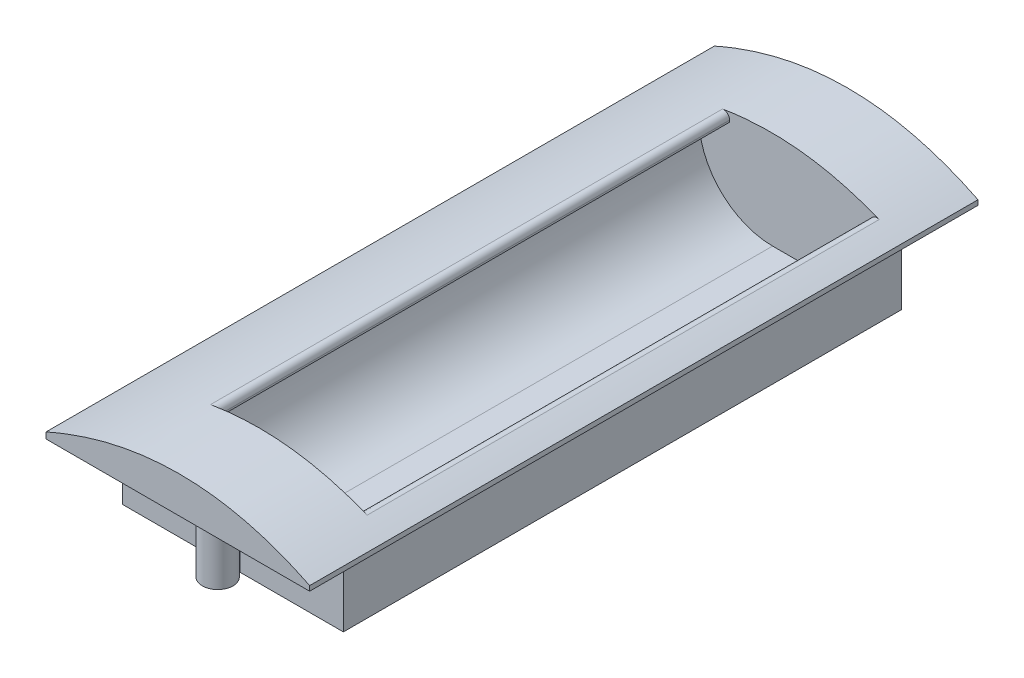
ISO-10303-21;
HEADER;
FILE_DESCRIPTION(('STEP AP214'),'2;1');
FILE_NAME('part.step','',(''),(''),'','','');
FILE_SCHEMA(('AUTOMOTIVE_DESIGN { 1 0 10303 214 1 1 1 1 }'));
ENDSEC;
DATA;
#1=APPLICATION_CONTEXT('core data for automotive mechanical design processes');
#2=APPLICATION_PROTOCOL_DEFINITION('international standard','automotive_design',2000,#1);
#3=PRODUCT_CONTEXT('',#1,'mechanical');
#4=PRODUCT('Part','Part','',(#3));
#5=PRODUCT_RELATED_PRODUCT_CATEGORY('part','',(#4));
#6=PRODUCT_DEFINITION_FORMATION('','',#4);
#7=PRODUCT_DEFINITION_CONTEXT('part definition',#1,'design');
#8=PRODUCT_DEFINITION('design','',#6,#7);
#9=PRODUCT_DEFINITION_SHAPE('','',#8);
#10=(LENGTH_UNIT() NAMED_UNIT(*) SI_UNIT(.MILLI.,.METRE.));
#11=(NAMED_UNIT(*) PLANE_ANGLE_UNIT() SI_UNIT($,.RADIAN.));
#12=(NAMED_UNIT(*) SI_UNIT($,.STERADIAN.) SOLID_ANGLE_UNIT());
#13=UNCERTAINTY_MEASURE_WITH_UNIT(LENGTH_MEASURE(1.E-05),#10,'distance_accuracy_value','');
#14=(GEOMETRIC_REPRESENTATION_CONTEXT(3) GLOBAL_UNCERTAINTY_ASSIGNED_CONTEXT((#13)) GLOBAL_UNIT_ASSIGNED_CONTEXT((#10,
#11,#12)) REPRESENTATION_CONTEXT('',''));
#15=CARTESIAN_POINT('',(0.,0.,0.));
#16=DIRECTION('',(0.,0.,1.));
#17=DIRECTION('',(1.,0.,0.));
#18=AXIS2_PLACEMENT_3D('',#15,#16,#17);
#19=CARTESIAN_POINT('',(-13.09332242383,11.49725164422,12.5));
#20=DIRECTION('',(0.,1.,0.));
#21=DIRECTION('',(0.,0.,1.));
#22=AXIS2_PLACEMENT_3D('',#19,#20,#21);
#23=PLANE('',#22);
#24=DIRECTION('',(0.,0.,-1.));
#25=VECTOR('',#24,1.);
#26=CARTESIAN_POINT('',(-8.093322423834,11.49725164422,96.));
#27=LINE('',#26,#25);
#28=CARTESIAN_POINT('',(-8.093322423834,11.49725164422,96.));
#29=VERTEX_POINT('',#28);
#30=CARTESIAN_POINT('',(-8.093322423834,11.49725164422,12.5));
#31=VERTEX_POINT('',#30);
#32=EDGE_CURVE('E161',#29,#31,#27,.T.);
#33=ORIENTED_EDGE('',*,*,#32,.F.);
#34=DIRECTION('',(-1.,0.,0.));
#35=VECTOR('',#34,1.);
#36=CARTESIAN_POINT('',(14.90667757617,11.49725164422,96.));
#37=LINE('',#36,#35);
#38=CARTESIAN_POINT('',(-13.09332242383,11.49725164422,96.));
#39=VERTEX_POINT('',#38);
#40=EDGE_CURVE('E148',#39,#29,#37,.F.);
#41=ORIENTED_EDGE('',*,*,#40,.F.);
#42=DIRECTION('',(0.,0.,-1.));
#43=VECTOR('',#42,1.);
#44=CARTESIAN_POINT('',(-13.09332242383,11.49725164422,0.));
#45=LINE('',#44,#43);
#46=CARTESIAN_POINT('',(-13.09332242383,11.49725164422,12.5));
#47=VERTEX_POINT('',#46);
#48=EDGE_CURVE('E143',#47,#39,#45,.F.);
#49=ORIENTED_EDGE('',*,*,#48,.F.);
#50=DIRECTION('',(1.,0.,0.));
#51=VECTOR('',#50,1.);
#52=CARTESIAN_POINT('',(-8.093322423834,11.49725164422,12.5));
#53=LINE('',#52,#51);
#54=EDGE_CURVE('E163',#31,#47,#53,.F.);
#55=ORIENTED_EDGE('',*,*,#54,.F.);
#56=EDGE_LOOP('',(#33,#41,#49,#55));
#57=FACE_BOUND('',#56,.T.);
#58=ADVANCED_FACE('F17',(#57),#23,.F.);
#59=CARTESIAN_POINT('',(-13.09332242383,0.,0.));
#60=DIRECTION('',(1.,0.,0.));
#61=DIRECTION('',(0.,0.,-1.));
#62=AXIS2_PLACEMENT_3D('',#59,#60,#61);
#63=PLANE('',#62);
#64=ORIENTED_EDGE('',*,*,#48,.T.);
#65=DIRECTION('',(0.,1.,0.));
#66=VECTOR('',#65,1.);
#67=CARTESIAN_POINT('',(-13.09332242383,-2.502748355781,96.));
#68=LINE('',#67,#66);
#69=CARTESIAN_POINT('',(-13.093322423832,9.497251644219,96.));
#70=VERTEX_POINT('',#69);
#71=EDGE_CURVE('E156',#70,#39,#68,.T.);
#72=ORIENTED_EDGE('',*,*,#71,.F.);
#73=DIRECTION('',(0.,0.,-1.));
#74=VECTOR('',#73,1.);
#75=CARTESIAN_POINT('',(-13.093322423834,9.497251644219,0.));
#76=LINE('',#75,#74);
#77=CARTESIAN_POINT('',(-13.093322423832,9.497251644219,12.5));
#78=VERTEX_POINT('',#77);
#79=EDGE_CURVE('E201',#70,#78,#76,.T.);
#80=ORIENTED_EDGE('',*,*,#79,.T.);
#81=DIRECTION('',(0.,1.,0.));
#82=VECTOR('',#81,1.);
#83=CARTESIAN_POINT('',(-13.09332242383,-2.502748355781,12.5));
#84=LINE('',#83,#82);
#85=EDGE_CURVE('E208',#47,#78,#84,.F.);
#86=ORIENTED_EDGE('',*,*,#85,.F.);
#87=EDGE_LOOP('',(#64,#72,#80,#86));
#88=FACE_BOUND('',#87,.T.);
#89=ADVANCED_FACE('F308',(#88),#63,.T.);
#90=CARTESIAN_POINT('',(-1.093322423834,9.497251644219,0.));
#91=DIRECTION('',(0.,0.,-1.));
#92=DIRECTION('',(-1.,0.,0.));
#93=AXIS2_PLACEMENT_3D('',#90,#91,#92);
#94=CYLINDRICAL_SURFACE('',#93,12.);
#95=CARTESIAN_POINT('',(-1.093322423834,9.497251644219,96.));
#96=DIRECTION('',(0.,0.,-1.));
#97=DIRECTION('',(-1.,0.,0.));
#98=AXIS2_PLACEMENT_3D('',#95,#96,#97);
#99=CIRCLE('',#98,12.);
#100=CARTESIAN_POINT('',(-1.093322423834,-2.502748355781,96.));
#101=VERTEX_POINT('',#100);
#102=EDGE_CURVE('E23',#101,#70,#99,.T.);
#103=ORIENTED_EDGE('',*,*,#102,.F.);
#104=DIRECTION('',(0.,0.,-1.));
#105=VECTOR('',#104,1.);
#106=CARTESIAN_POINT('',(-1.093322423834,-2.502748355781,0.));
#107=LINE('',#106,#105);
#108=CARTESIAN_POINT('',(-1.093322423834,-2.502748355781,12.5));
#109=VERTEX_POINT('',#108);
#110=EDGE_CURVE('E122',#101,#109,#107,.T.);
#111=ORIENTED_EDGE('',*,*,#110,.T.);
#112=CARTESIAN_POINT('',(-1.093322423834,9.497251644219,12.5));
#113=DIRECTION('',(0.,0.,-1.));
#114=DIRECTION('',(-1.,0.,0.));
#115=AXIS2_PLACEMENT_3D('',#112,#113,#114);
#116=CIRCLE('',#115,12.);
#117=EDGE_CURVE('E245',#78,#109,#116,.F.);
#118=ORIENTED_EDGE('',*,*,#117,.F.);
#119=ORIENTED_EDGE('',*,*,#79,.F.);
#120=EDGE_LOOP('',(#103,#111,#118,#119));
#121=FACE_BOUND('',#120,.T.);
#122=ADVANCED_FACE('F305',(#121),#94,.F.);
#123=CARTESIAN_POINT('',(0.,-2.502748355781,0.));
#124=DIRECTION('',(0.,-1.,0.));
#125=DIRECTION('',(0.,0.,-1.));
#126=AXIS2_PLACEMENT_3D('',#123,#124,#125);
#127=PLANE('',#126);
#128=DIRECTION('',(1.,0.,0.));
#129=VECTOR('',#128,1.);
#130=CARTESIAN_POINT('',(-8.093322423834,-2.502748355781,12.5));
#131=LINE('',#130,#129);
#132=CARTESIAN_POINT('',(14.90667757617,-2.502748355781,12.5));
#133=VERTEX_POINT('',#132);
#134=EDGE_CURVE('E246',#109,#133,#131,.T.);
#135=ORIENTED_EDGE('',*,*,#134,.F.);
#136=ORIENTED_EDGE('',*,*,#110,.F.);
#137=DIRECTION('',(-1.,0.,0.));
#138=VECTOR('',#137,1.);
#139=CARTESIAN_POINT('',(14.90667757617,-2.502748355781,96.));
#140=LINE('',#139,#138);
#141=CARTESIAN_POINT('',(14.90667757617,-2.502748355781,96.));
#142=VERTEX_POINT('',#141);
#143=EDGE_CURVE('E187',#142,#101,#140,.T.);
#144=ORIENTED_EDGE('',*,*,#143,.F.);
#145=DIRECTION('',(0.,0.,1.));
#146=VECTOR('',#145,1.);
#147=CARTESIAN_POINT('',(14.90667757617,-2.502748355781,12.5));
#148=LINE('',#147,#146);
#149=EDGE_CURVE('E132',#133,#142,#148,.T.);
#150=ORIENTED_EDGE('',*,*,#149,.F.);
#151=EDGE_LOOP('',(#135,#136,#144,#150));
#152=FACE_BOUND('',#151,.T.);
#153=ADVANCED_FACE('F302',(#152),#127,.F.);
#154=CARTESIAN_POINT('',(14.90667757617,-2.502748355781,12.5));
#155=DIRECTION('',(-1.,0.,0.));
#156=DIRECTION('',(0.,0.,1.));
#157=AXIS2_PLACEMENT_3D('',#154,#155,#156);
#158=PLANE('',#157);
#159=ORIENTED_EDGE('',*,*,#149,.T.);
#160=DIRECTION('',(0.,1.,0.));
#161=VECTOR('',#160,1.);
#162=CARTESIAN_POINT('',(14.90667757617,-2.502748355781,96.));
#163=LINE('',#162,#161);
#164=CARTESIAN_POINT('',(14.90667757617,9.001438316908,96.));
#165=VERTEX_POINT('',#164);
#166=EDGE_CURVE('E167',#165,#142,#163,.F.);
#167=ORIENTED_EDGE('',*,*,#166,.F.);
#168=DIRECTION('',(0.,0.,-1.));
#169=VECTOR('',#168,1.);
#170=CARTESIAN_POINT('',(14.90667757617,9.001438316908,54.25));
#171=LINE('',#170,#169);
#172=CARTESIAN_POINT('',(14.90667757617,9.001438316908,12.5));
#173=VERTEX_POINT('',#172);
#174=EDGE_CURVE('E172',#173,#165,#171,.F.);
#175=ORIENTED_EDGE('',*,*,#174,.F.);
#176=DIRECTION('',(0.,1.,0.));
#177=VECTOR('',#176,1.);
#178=CARTESIAN_POINT('',(14.90667757617,-2.502748355781,12.5));
#179=LINE('',#178,#177);
#180=EDGE_CURVE('E244',#133,#173,#179,.T.);
#181=ORIENTED_EDGE('',*,*,#180,.F.);
#182=EDGE_LOOP('',(#159,#167,#175,#181));
#183=FACE_BOUND('',#182,.T.);
#184=ADVANCED_FACE('F299',(#183),#158,.T.);
#185=CARTESIAN_POINT('',(-8.093322423834,-2.502748355781,96.));
#186=DIRECTION('',(1.,0.,0.));
#187=DIRECTION('',(0.,0.,-1.));
#188=AXIS2_PLACEMENT_3D('',#185,#186,#187);
#189=PLANE('',#188);
#190=ORIENTED_EDGE('',*,*,#32,.T.);
#191=DIRECTION('',(0.,1.,0.));
#192=VECTOR('',#191,1.);
#193=CARTESIAN_POINT('',(-8.093322423834,-2.502748355781,12.5));
#194=LINE('',#193,#192);
#195=CARTESIAN_POINT('',(-8.093322423834,11.79171654104,12.5));
#196=VERTEX_POINT('',#195);
#197=EDGE_CURVE('E209',#196,#31,#194,.F.);
#198=ORIENTED_EDGE('',*,*,#197,.F.);
#199=DIRECTION('',(0.,0.,-1.));
#200=VECTOR('',#199,1.);
#201=CARTESIAN_POINT('',(-8.093322423834,11.79171654104,54.25));
#202=LINE('',#201,#200);
#203=CARTESIAN_POINT('',(-8.093322423834,11.79171654104,96.));
#204=VERTEX_POINT('',#203);
#205=EDGE_CURVE('E171',#204,#196,#202,.T.);
#206=ORIENTED_EDGE('',*,*,#205,.F.);
#207=DIRECTION('',(0.,1.,0.));
#208=VECTOR('',#207,1.);
#209=CARTESIAN_POINT('',(-8.093322423834,-2.502748355781,96.));
#210=LINE('',#209,#208);
#211=EDGE_CURVE('E153',#29,#204,#210,.T.);
#212=ORIENTED_EDGE('',*,*,#211,.F.);
#213=EDGE_LOOP('',(#190,#198,#206,#212));
#214=FACE_BOUND('',#213,.T.);
#215=ADVANCED_FACE('F170',(#214),#189,.T.);
#216=CARTESIAN_POINT('',(14.90667757617,-2.502748355781,96.));
#217=DIRECTION('',(0.,0.,-1.));
#218=DIRECTION('',(-1.,0.,0.));
#219=AXIS2_PLACEMENT_3D('',#216,#217,#218);
#220=PLANE('',#219);
#221=ORIENTED_EDGE('',*,*,#211,.T.);
#222=CARTESIAN_POINT('',(-9.093322423834,11.79171654104,96.));
#223=DIRECTION('',(0.,0.,-1.));
#224=DIRECTION('',(-1.,0.,0.));
#225=AXIS2_PLACEMENT_3D('',#222,#223,#224);
#226=CIRCLE('',#225,1.);
#227=CARTESIAN_POINT('',(-9.25970111752985,12.7777784712891,96.));
#228=VERTEX_POINT('',#227);
#229=EDGE_CURVE('E195',#228,#204,#226,.T.);
#230=ORIENTED_EDGE('',*,*,#229,.F.);
#231=CARTESIAN_POINT('',(-9.25970111752978,12.7777784712887,96.));
#232=CARTESIAN_POINT('',(3.83691687839008,14.9875769911942,96.));
#233=CARTESIAN_POINT('',(16.2832736563201,9.92781588162716,96.));
#234=B_SPLINE_CURVE_WITH_KNOTS('',2,(#231,#232,#233),.UNSPECIFIED.,.F.,.F.,(3,3),(0.,1.),.UNSPECIFIED.);
#235=CARTESIAN_POINT('',(16.2832736563201,9.92781588162716,96.));
#236=VERTEX_POINT('',#235);
#237=EDGE_CURVE('E178',#228,#236,#234,.T.);
#238=ORIENTED_EDGE('',*,*,#237,.T.);
#239=CARTESIAN_POINT('',(15.90667757617,9.001438316908,96.));
#240=DIRECTION('',(0.,0.,-1.));
#241=DIRECTION('',(-1.,0.,0.));
#242=AXIS2_PLACEMENT_3D('',#239,#240,#241);
#243=CIRCLE('',#242,1.);
#244=EDGE_CURVE('E174',#165,#236,#243,.T.);
#245=ORIENTED_EDGE('',*,*,#244,.F.);
#246=ORIENTED_EDGE('',*,*,#166,.T.);
#247=ORIENTED_EDGE('',*,*,#143,.T.);
#248=ORIENTED_EDGE('',*,*,#102,.T.);
#249=ORIENTED_EDGE('',*,*,#71,.T.);
#250=ORIENTED_EDGE('',*,*,#40,.T.);
#251=EDGE_LOOP('',(#221,#230,#238,#245,#246,#247,#248,#249,#250));
#252=FACE_BOUND('',#251,.T.);
#253=ADVANCED_FACE('F150',(#252),#220,.T.);
#254=CARTESIAN_POINT('',(15.90667757617,9.001438316908,54.25));
#255=DIRECTION('',(0.,0.,-1.));
#256=DIRECTION('',(-1.,0.,0.));
#257=AXIS2_PLACEMENT_3D('',#254,#255,#256);
#258=CYLINDRICAL_SURFACE('',#257,1.);
#259=ORIENTED_EDGE('',*,*,#174,.T.);
#260=ORIENTED_EDGE('',*,*,#244,.T.);
#261=DIRECTION('',(0.,0.,-1.));
#262=VECTOR('',#261,1.);
#263=CARTESIAN_POINT('',(16.2832736563199,9.92781588162687,54.5));
#264=LINE('',#263,#262);
#265=CARTESIAN_POINT('',(16.2832736563201,9.92781588162716,12.5));
#266=VERTEX_POINT('',#265);
#267=EDGE_CURVE('E260',#236,#266,#264,.T.);
#268=ORIENTED_EDGE('',*,*,#267,.T.);
#269=CARTESIAN_POINT('',(15.90667757617,9.001438316908,12.5));
#270=DIRECTION('',(0.,0.,-1.));
#271=DIRECTION('',(-1.,0.,0.));
#272=AXIS2_PLACEMENT_3D('',#269,#270,#271);
#273=CIRCLE('',#272,1.);
#274=EDGE_CURVE('E242',#173,#266,#273,.T.);
#275=ORIENTED_EDGE('',*,*,#274,.F.);
#276=EDGE_LOOP('',(#259,#260,#268,#275));
#277=FACE_BOUND('',#276,.T.);
#278=ADVANCED_FACE('F291',(#277),#258,.T.);
#279=CARTESIAN_POINT('',(-8.093322423834,-2.502748355781,12.5));
#280=DIRECTION('',(0.,0.,1.));
#281=DIRECTION('',(1.,0.,0.));
#282=AXIS2_PLACEMENT_3D('',#279,#280,#281);
#283=PLANE('',#282);
#284=ORIENTED_EDGE('',*,*,#274,.T.);
#285=CARTESIAN_POINT('',(16.2832736563201,9.92781588162716,12.5));
#286=CARTESIAN_POINT('',(3.83691687839007,14.9875769911942,12.5));
#287=CARTESIAN_POINT('',(-9.25970111752978,12.7777784712887,12.5));
#288=B_SPLINE_CURVE_WITH_KNOTS('',2,(#285,#286,#287),.UNSPECIFIED.,.F.,.F.,(3,3),(0.,1.),.UNSPECIFIED.);
#289=CARTESIAN_POINT('',(-9.25970111752978,12.7777784712887,12.5));
#290=VERTEX_POINT('',#289);
#291=EDGE_CURVE('E261',#266,#290,#288,.T.);
#292=ORIENTED_EDGE('',*,*,#291,.T.);
#293=CARTESIAN_POINT('',(-9.093322423834,11.79171654104,12.5));
#294=DIRECTION('',(0.,0.,-1.));
#295=DIRECTION('',(-1.,0.,0.));
#296=AXIS2_PLACEMENT_3D('',#293,#294,#295);
#297=CIRCLE('',#296,1.);
#298=EDGE_CURVE('E194',#196,#290,#297,.F.);
#299=ORIENTED_EDGE('',*,*,#298,.F.);
#300=ORIENTED_EDGE('',*,*,#197,.T.);
#301=ORIENTED_EDGE('',*,*,#54,.T.);
#302=ORIENTED_EDGE('',*,*,#85,.T.);
#303=ORIENTED_EDGE('',*,*,#117,.T.);
#304=ORIENTED_EDGE('',*,*,#134,.T.);
#305=ORIENTED_EDGE('',*,*,#180,.T.);
#306=EDGE_LOOP('',(#284,#292,#299,#300,#301,#302,#303,#304,#305));
#307=FACE_BOUND('',#306,.T.);
#308=ADVANCED_FACE('F280',(#307),#283,.T.);
#309=CARTESIAN_POINT('',(-9.093322423834,11.79171654104,54.25));
#310=DIRECTION('',(0.,0.,-1.));
#311=DIRECTION('',(-1.,0.,0.));
#312=AXIS2_PLACEMENT_3D('',#309,#310,#311);
#313=CYLINDRICAL_SURFACE('',#312,1.);
#314=ORIENTED_EDGE('',*,*,#205,.T.);
#315=ORIENTED_EDGE('',*,*,#298,.T.);
#316=DIRECTION('',(0.,0.,1.));
#317=VECTOR('',#316,1.);
#318=CARTESIAN_POINT('',(-9.25970111752991,12.7777784712895,54.5));
#319=LINE('',#318,#317);
#320=EDGE_CURVE('E262',#290,#228,#319,.T.);
#321=ORIENTED_EDGE('',*,*,#320,.T.);
#322=ORIENTED_EDGE('',*,*,#229,.T.);
#323=EDGE_LOOP('',(#314,#315,#321,#322));
#324=FACE_BOUND('',#323,.T.);
#325=ADVANCED_FACE('F290',(#324),#313,.T.);
#326=CARTESIAN_POINT('',(19.9066775762611,8.29395618811691,109.));
#327=CARTESIAN_POINT('',(19.9066775762611,8.29395618811691,0.));
#328=CARTESIAN_POINT('',(6.1760452662926,15.0995843819134,109.));
#329=CARTESIAN_POINT('',(6.1760452662926,15.0995843819134,0.));
#330=CARTESIAN_POINT('',(-8.15728806707194,15.1673495339444,109.));
#331=CARTESIAN_POINT('',(-8.15728806707194,15.1673495339444,0.));
#332=CARTESIAN_POINT('',(-23.0933224238306,8.49725164422039,109.));
#333=CARTESIAN_POINT('',(-23.0933224238306,8.49725164422039,0.));
#334=B_SPLINE_SURFACE_WITH_KNOTS('',3,1,((#326,#327),(#328,#329),(#330,#331),(#332,#333)),
.UNSPECIFIED.,.F.,.F.,.F.,(4,4),(2,2),(0.00949444863723441,0.991075013218606),(0.,1.),.UNSPECIFIED.);
#335=CARTESIAN_POINT('',(19.90667757617,8.293956188164,0.));
#336=CARTESIAN_POINT('',(-0.689270888749123,18.5023984787845,0.));
#337=CARTESIAN_POINT('',(-23.09332242383,8.497251644219,0.));
#338=B_SPLINE_CURVE_WITH_KNOTS('',2,(#335,#336,#337),.UNSPECIFIED.,.F.,.F.,(3,3),(0.,1.),.UNSPECIFIED.);
#339=CARTESIAN_POINT('',(19.90667757617,8.293956188164,0.));
#340=VERTEX_POINT('',#339);
#341=CARTESIAN_POINT('',(-23.09332242383,8.497251644219,0.));
#342=VERTEX_POINT('',#341);
#343=EDGE_CURVE('E268',#340,#342,#338,.T.);
#344=DIRECTION('',(0.,0.,-1.));
#345=VECTOR('',#344,1.);
#346=CARTESIAN_POINT('',(-23.09332242383,8.497251644219,109.));
#347=LINE('',#346,#345);
#348=CARTESIAN_POINT('',(-23.09332242383,8.497251644219,109.));
#349=VERTEX_POINT('',#348);
#350=EDGE_CURVE('E264',#342,#349,#347,.F.);
#351=CARTESIAN_POINT('',(19.90667757617,8.293956188164,109.));
#352=CARTESIAN_POINT('',(-0.689270888749123,18.5023984787845,109.));
#353=CARTESIAN_POINT('',(-23.09332242383,8.497251644219,109.));
#354=B_SPLINE_CURVE_WITH_KNOTS('',2,(#351,#352,#353),.UNSPECIFIED.,.F.,.F.,(3,3),(0.,1.),.UNSPECIFIED.);
#355=CARTESIAN_POINT('',(19.90667757617,8.293956188164,109.));
#356=VERTEX_POINT('',#355);
#357=EDGE_CURVE('E399',#356,#349,#354,.T.);
#358=DIRECTION('',(0.,0.,1.));
#359=VECTOR('',#358,1.);
#360=CARTESIAN_POINT('',(19.90667757617,8.293956188164,109.));
#361=LINE('',#360,#359);
#362=EDGE_CURVE('E467',#356,#340,#361,.F.);
#363=ORIENTED_EDGE('',*,*,#291,.F.);
#364=ORIENTED_EDGE('',*,*,#267,.F.);
#365=ORIENTED_EDGE('',*,*,#237,.F.);
#366=ORIENTED_EDGE('',*,*,#320,.F.);
#367=EDGE_LOOP('',(#363,#364,#365,#366));
#368=FACE_BOUND('',#367,.T.);
#369=ORIENTED_EDGE('',*,*,#343,.T.);
#370=ORIENTED_EDGE('',*,*,#350,.T.);
#371=ORIENTED_EDGE('',*,*,#357,.F.);
#372=ORIENTED_EDGE('',*,*,#362,.T.);
#373=EDGE_LOOP('',(#369,#370,#371,#372));
#374=FACE_BOUND('',#373,.T.);
#375=ADVANCED_FACE('F19',(#368,#374),#334,.F.);
#376=CARTESIAN_POINT('',(-23.09332242383,8.497251644219,109.));
#377=DIRECTION('',(1.,0.,0.));
#378=DIRECTION('',(0.,0.,-1.));
#379=AXIS2_PLACEMENT_3D('',#376,#377,#378);
#380=PLANE('',#379);
#381=DIRECTION('',(0.,0.,-1.));
#382=VECTOR('',#381,1.);
#383=CARTESIAN_POINT('',(-23.09332242383,7.497251644219,0.));
#384=LINE('',#383,#382);
#385=CARTESIAN_POINT('',(-23.09332242383,7.497251644219,109.));
#386=VERTEX_POINT('',#385);
#387=CARTESIAN_POINT('',(-23.09332242383,7.497251644219,0.));
#388=VERTEX_POINT('',#387);
#389=EDGE_CURVE('E447',#386,#388,#384,.T.);
#390=ORIENTED_EDGE('',*,*,#389,.F.);
#391=DIRECTION('',(0.,1.,0.));
#392=VECTOR('',#391,1.);
#393=CARTESIAN_POINT('',(-23.09332242383,13.44900119749,109.));
#394=LINE('',#393,#392);
#395=EDGE_CURVE('E403',#349,#386,#394,.F.);
#396=ORIENTED_EDGE('',*,*,#395,.F.);
#397=ORIENTED_EDGE('',*,*,#350,.F.);
#398=DIRECTION('',(0.,1.,0.));
#399=VECTOR('',#398,1.);
#400=CARTESIAN_POINT('',(-23.09332242383,13.44900119749,0.));
#401=LINE('',#400,#399);
#402=EDGE_CURVE('E425',#342,#388,#401,.F.);
#403=ORIENTED_EDGE('',*,*,#402,.T.);
#404=EDGE_LOOP('',(#390,#396,#397,#403));
#405=FACE_BOUND('',#404,.T.);
#406=ADVANCED_FACE('F435',(#405),#380,.F.);
#407=CARTESIAN_POINT('',(-1.141296656289,13.44900119749,0.));
#408=DIRECTION('',(0.,0.,1.));
#409=DIRECTION('',(1.,0.,0.));
#410=AXIS2_PLACEMENT_3D('',#407,#408,#409);
#411=PLANE('',#410);
#412=DIRECTION('',(1.,0.,0.));
#413=VECTOR('',#412,1.);
#414=CARTESIAN_POINT('',(0.,7.497251644219,0.));
#415=LINE('',#414,#413);
#416=CARTESIAN_POINT('',(19.90667757617,7.497251644219,0.));
#417=VERTEX_POINT('',#416);
#418=EDGE_CURVE('E455',#388,#417,#415,.T.);
#419=ORIENTED_EDGE('',*,*,#418,.F.);
#420=ORIENTED_EDGE('',*,*,#402,.F.);
#421=ORIENTED_EDGE('',*,*,#343,.F.);
#422=DIRECTION('',(0.,1.,0.));
#423=VECTOR('',#422,1.);
#424=CARTESIAN_POINT('',(19.90667757617,8.293956188164,0.));
#425=LINE('',#424,#423);
#426=EDGE_CURVE('E419',#340,#417,#425,.F.);
#427=ORIENTED_EDGE('',*,*,#426,.T.);
#428=EDGE_LOOP('',(#419,#420,#421,#427));
#429=FACE_BOUND('',#428,.T.);
#430=ADVANCED_FACE('F427',(#429),#411,.F.);
#431=CARTESIAN_POINT('',(19.90667757617,8.293956188164,109.));
#432=DIRECTION('',(-1.,0.,0.));
#433=DIRECTION('',(0.,0.,1.));
#434=AXIS2_PLACEMENT_3D('',#431,#432,#433);
#435=PLANE('',#434);
#436=DIRECTION('',(0.,0.,-1.));
#437=VECTOR('',#436,1.);
#438=CARTESIAN_POINT('',(19.90667757617,7.497251644219,0.));
#439=LINE('',#438,#437);
#440=CARTESIAN_POINT('',(19.90667757617,7.497251644219,109.));
#441=VERTEX_POINT('',#440);
#442=EDGE_CURVE('E458',#417,#441,#439,.F.);
#443=ORIENTED_EDGE('',*,*,#442,.F.);
#444=ORIENTED_EDGE('',*,*,#426,.F.);
#445=ORIENTED_EDGE('',*,*,#362,.F.);
#446=DIRECTION('',(0.,1.,0.));
#447=VECTOR('',#446,1.);
#448=CARTESIAN_POINT('',(19.90667757617,13.44900119749,109.));
#449=LINE('',#448,#447);
#450=EDGE_CURVE('E404',#441,#356,#449,.T.);
#451=ORIENTED_EDGE('',*,*,#450,.F.);
#452=EDGE_LOOP('',(#443,#444,#445,#451));
#453=FACE_BOUND('',#452,.T.);
#454=ADVANCED_FACE('F395',(#453),#435,.F.);
#455=CARTESIAN_POINT('',(-1.141296656289,13.44900119749,109.));
#456=DIRECTION('',(0.,0.,1.));
#457=DIRECTION('',(1.,0.,0.));
#458=AXIS2_PLACEMENT_3D('',#455,#456,#457);
#459=PLANE('',#458);
#460=ORIENTED_EDGE('',*,*,#357,.T.);
#461=ORIENTED_EDGE('',*,*,#395,.T.);
#462=DIRECTION('',(1.,0.,0.));
#463=VECTOR('',#462,1.);
#464=CARTESIAN_POINT('',(0.,7.497251644219,109.));
#465=LINE('',#464,#463);
#466=EDGE_CURVE('E472',#441,#386,#465,.F.);
#467=ORIENTED_EDGE('',*,*,#466,.F.);
#468=ORIENTED_EDGE('',*,*,#450,.T.);
#469=EDGE_LOOP('',(#460,#461,#467,#468));
#470=FACE_BOUND('',#469,.T.);
#471=ADVANCED_FACE('F390',(#470),#459,.T.);
#472=CARTESIAN_POINT('',(-0.4338577869394,-4.502748355781,9.00000000000001));
#473=DIRECTION('',(-1.,0.,0.));
#474=DIRECTION('',(0.,0.,1.));
#475=AXIS2_PLACEMENT_3D('',#472,#473,#474);
#476=PLANE('',#475);
#477=DIRECTION('',(0.,0.,-1.));
#478=VECTOR('',#477,1.);
#479=CARTESIAN_POINT('',(-0.4338577869394,7.497251644219,0.));
#480=LINE('',#479,#478);
#481=CARTESIAN_POINT('',(-0.4338577869394,7.497251644219,9.));
#482=VERTEX_POINT('',#481);
#483=CARTESIAN_POINT('',(-0.433857786939404,7.497251644219,8.71486833825194));
#484=VERTEX_POINT('',#483);
#485=EDGE_CURVE('E706',#482,#484,#480,.T.);
#486=ORIENTED_EDGE('',*,*,#485,.F.);
#487=DIRECTION('',(0.,1.,0.));
#488=VECTOR('',#487,1.);
#489=CARTESIAN_POINT('',(-0.433857786939398,7.497251644219,9.00000000000001));
#490=LINE('',#489,#488);
#491=CARTESIAN_POINT('',(-0.433857786939399,-4.502748355781,9.00000000000001));
#492=VERTEX_POINT('',#491);
#493=EDGE_CURVE('E764',#492,#482,#490,.T.);
#494=ORIENTED_EDGE('',*,*,#493,.F.);
#495=DIRECTION('',(0.,0.,1.));
#496=VECTOR('',#495,1.);
#497=CARTESIAN_POINT('',(-0.4338577869394,-4.502748355781,9.00000000000001));
#498=LINE('',#497,#496);
#499=CARTESIAN_POINT('',(-0.433857786939404,-4.502748355781,8.71486833825194));
#500=VERTEX_POINT('',#499);
#501=EDGE_CURVE('E414',#500,#492,#498,.T.);
#502=ORIENTED_EDGE('',*,*,#501,.F.);
#503=DIRECTION('',(0.,1.,0.));
#504=VECTOR('',#503,1.);
#505=CARTESIAN_POINT('',(-0.433857786939407,-4.502748355781,8.71486833825194));
#506=LINE('',#505,#504);
#507=EDGE_CURVE('E238',#484,#500,#506,.F.);
#508=ORIENTED_EDGE('',*,*,#507,.F.);
#509=EDGE_LOOP('',(#486,#494,#502,#508));
#510=FACE_BOUND('',#509,.T.);
#511=ADVANCED_FACE('F386',(#510),#476,.F.);
#512=CARTESIAN_POINT('',(-2.752787060729,-4.502748355781,8.714868338252));
#513=DIRECTION('',(1.,0.,0.));
#514=DIRECTION('',(0.,0.,-1.));
#515=AXIS2_PLACEMENT_3D('',#512,#513,#514);
#516=PLANE('',#515);
#517=DIRECTION('',(0.,0.,-1.));
#518=VECTOR('',#517,1.);
#519=CARTESIAN_POINT('',(-2.75278706072895,7.497251644219,0.));
#520=LINE('',#519,#518);
#521=CARTESIAN_POINT('',(-2.75278706072896,7.497251644219,8.71486833825175));
#522=VERTEX_POINT('',#521);
#523=CARTESIAN_POINT('',(-2.75278706072895,7.497251644219,9.00000000000001));
#524=VERTEX_POINT('',#523);
#525=EDGE_CURVE('E773',#522,#524,#520,.F.);
#526=ORIENTED_EDGE('',*,*,#525,.F.);
#527=DIRECTION('',(0.,1.,0.));
#528=VECTOR('',#527,1.);
#529=CARTESIAN_POINT('',(-2.75278706072897,-4.502748355781,8.71486833825174));
#530=LINE('',#529,#528);
#531=CARTESIAN_POINT('',(-2.75278706072899,-4.502748355781,8.71486833825173));
#532=VERTEX_POINT('',#531);
#533=EDGE_CURVE('E239',#532,#522,#530,.T.);
#534=ORIENTED_EDGE('',*,*,#533,.F.);
#535=DIRECTION('',(0.,0.,-1.));
#536=VECTOR('',#535,1.);
#537=CARTESIAN_POINT('',(-2.752787060729,-4.502748355781,8.714868338252));
#538=LINE('',#537,#536);
#539=CARTESIAN_POINT('',(-2.75278706072897,-4.502748355781,9.00000000000001));
#540=VERTEX_POINT('',#539);
#541=EDGE_CURVE('E789',#540,#532,#538,.T.);
#542=ORIENTED_EDGE('',*,*,#541,.F.);
#543=DIRECTION('',(0.,1.,0.));
#544=VECTOR('',#543,1.);
#545=CARTESIAN_POINT('',(-2.75278706072895,7.497251644219,9.00000000000001));
#546=LINE('',#545,#544);
#547=EDGE_CURVE('E756',#524,#540,#546,.F.);
#548=ORIENTED_EDGE('',*,*,#547,.F.);
#549=EDGE_LOOP('',(#526,#534,#542,#548));
#550=FACE_BOUND('',#549,.T.);
#551=ADVANCED_FACE('F382',(#550),#516,.F.);
#552=CARTESIAN_POINT('',(-2.752787060729,-4.502748355781,100.2851316617));
#553=DIRECTION('',(1.,0.,0.));
#554=DIRECTION('',(0.,0.,-1.));
#555=AXIS2_PLACEMENT_3D('',#552,#553,#554);
#556=PLANE('',#555);
#557=DIRECTION('',(0.,0.,-1.));
#558=VECTOR('',#557,1.);
#559=CARTESIAN_POINT('',(-2.752787060729,7.497251644219,0.));
#560=LINE('',#559,#558);
#561=CARTESIAN_POINT('',(-2.752787060729,7.497251644219,100.));
#562=VERTEX_POINT('',#561);
#563=CARTESIAN_POINT('',(-2.75278706072652,7.497251644219,100.285131661747));
#564=VERTEX_POINT('',#563);
#565=EDGE_CURVE('E769',#562,#564,#560,.F.);
#566=ORIENTED_EDGE('',*,*,#565,.F.);
#567=DIRECTION('',(0.,1.,0.));
#568=VECTOR('',#567,1.);
#569=CARTESIAN_POINT('',(-2.752787060729,7.497251644219,100.));
#570=LINE('',#569,#568);
#571=CARTESIAN_POINT('',(-2.752787060729,-4.502748355781,100.));
#572=VERTEX_POINT('',#571);
#573=EDGE_CURVE('E749',#572,#562,#570,.T.);
#574=ORIENTED_EDGE('',*,*,#573,.F.);
#575=DIRECTION('',(0.,0.,-1.));
#576=VECTOR('',#575,1.);
#577=CARTESIAN_POINT('',(-2.752787060729,-4.502748355781,100.2851316617));
#578=LINE('',#577,#576);
#579=CARTESIAN_POINT('',(-2.75278706072652,-4.502748355781,100.285131661747));
#580=VERTEX_POINT('',#579);
#581=EDGE_CURVE('E459',#580,#572,#578,.T.);
#582=ORIENTED_EDGE('',*,*,#581,.F.);
#583=DIRECTION('',(0.,1.,0.));
#584=VECTOR('',#583,1.);
#585=CARTESIAN_POINT('',(-2.75278706072403,-4.502748355781,100.285131661746));
#586=LINE('',#585,#584);
#587=EDGE_CURVE('E740',#564,#580,#586,.F.);
#588=ORIENTED_EDGE('',*,*,#587,.F.);
#589=EDGE_LOOP('',(#566,#574,#582,#588));
#590=FACE_BOUND('',#589,.T.);
#591=ADVANCED_FACE('F378',(#590),#556,.F.);
#592=CARTESIAN_POINT('',(-0.4338577869394,-4.502748355781,100.));
#593=DIRECTION('',(-1.,0.,0.));
#594=DIRECTION('',(0.,0.,1.));
#595=AXIS2_PLACEMENT_3D('',#592,#593,#594);
#596=PLANE('',#595);
#597=DIRECTION('',(0.,0.,-1.));
#598=VECTOR('',#597,1.);
#599=CARTESIAN_POINT('',(-0.433857786949278,7.497251644219,0.));
#600=LINE('',#599,#598);
#601=CARTESIAN_POINT('',(-0.433857786946815,7.497251644219,100.285131661744));
#602=VERTEX_POINT('',#601);
#603=CARTESIAN_POINT('',(-0.433857786949278,7.497251644219,100.));
#604=VERTEX_POINT('',#603);
#605=EDGE_CURVE('E705',#602,#604,#600,.T.);
#606=ORIENTED_EDGE('',*,*,#605,.F.);
#607=DIRECTION('',(0.,1.,0.));
#608=VECTOR('',#607,1.);
#609=CARTESIAN_POINT('',(-0.433857786944352,-4.502748355781,100.285131661746));
#610=LINE('',#609,#608);
#611=CARTESIAN_POINT('',(-0.433857786941876,-4.502748355781,100.285131661747));
#612=VERTEX_POINT('',#611);
#613=EDGE_CURVE('E234',#612,#602,#610,.T.);
#614=ORIENTED_EDGE('',*,*,#613,.F.);
#615=DIRECTION('',(0.,0.,1.));
#616=VECTOR('',#615,1.);
#617=CARTESIAN_POINT('',(-0.4338577869394,-4.502748355781,100.));
#618=LINE('',#617,#616);
#619=CARTESIAN_POINT('',(-0.433857786944338,-4.502748355781,100.));
#620=VERTEX_POINT('',#619);
#621=EDGE_CURVE('E456',#620,#612,#618,.T.);
#622=ORIENTED_EDGE('',*,*,#621,.F.);
#623=DIRECTION('',(0.,1.,0.));
#624=VECTOR('',#623,1.);
#625=CARTESIAN_POINT('',(-0.433857786949276,7.497251644219,100.));
#626=LINE('',#625,#624);
#627=EDGE_CURVE('E772',#604,#620,#626,.F.);
#628=ORIENTED_EDGE('',*,*,#627,.F.);
#629=EDGE_LOOP('',(#606,#614,#622,#628));
#630=FACE_BOUND('',#629,.T.);
#631=ADVANCED_FACE('F374',(#630),#596,.F.);
#632=CARTESIAN_POINT('',(0.,7.497251644219,0.));
#633=DIRECTION('',(0.,-1.,0.));
#634=DIRECTION('',(0.,0.,-1.));
#635=AXIS2_PLACEMENT_3D('',#632,#633,#634);
#636=PLANE('',#635);
#637=ORIENTED_EDGE('',*,*,#565,.T.);
#638=CARTESIAN_POINT('',(-1.593322423834,7.497251644219,102.5));
#639=DIRECTION('',(0.,1.,0.));
#640=DIRECTION('',(0.,0.,1.));
#641=AXIS2_PLACEMENT_3D('',#638,#639,#640);
#642=CIRCLE('',#641,2.5);
#643=EDGE_CURVE('E232',#602,#564,#642,.F.);
#644=ORIENTED_EDGE('',*,*,#643,.F.);
#645=ORIENTED_EDGE('',*,*,#605,.T.);
#646=DIRECTION('',(1.,0.,0.));
#647=VECTOR('',#646,1.);
#648=CARTESIAN_POINT('',(-19.59332242383,7.497251644219,100.));
#649=LINE('',#648,#647);
#650=CARTESIAN_POINT('',(16.40667757617,7.497251644219,100.));
#651=VERTEX_POINT('',#650);
#652=EDGE_CURVE('E768',#651,#604,#649,.F.);
#653=ORIENTED_EDGE('',*,*,#652,.F.);
#654=DIRECTION('',(0.,0.,-1.));
#655=VECTOR('',#654,1.);
#656=CARTESIAN_POINT('',(16.40667757617,7.497251644219,9.00000000000001));
#657=LINE('',#656,#655);
#658=CARTESIAN_POINT('',(16.40667757617,7.497251644219,9.));
#659=VERTEX_POINT('',#658);
#660=EDGE_CURVE('E765',#659,#651,#657,.F.);
#661=ORIENTED_EDGE('',*,*,#660,.F.);
#662=DIRECTION('',(-1.,0.,0.));
#663=VECTOR('',#662,1.);
#664=CARTESIAN_POINT('',(-19.59332242383,7.497251644219,9.00000000000001));
#665=LINE('',#664,#663);
#666=EDGE_CURVE('E761',#482,#659,#665,.F.);
#667=ORIENTED_EDGE('',*,*,#666,.F.);
#668=ORIENTED_EDGE('',*,*,#485,.T.);
#669=CARTESIAN_POINT('',(-1.593322423834,7.497251644219,6.5));
#670=DIRECTION('',(0.,1.,0.));
#671=DIRECTION('',(0.,0.,1.));
#672=AXIS2_PLACEMENT_3D('',#669,#670,#671);
#673=CIRCLE('',#672,2.5);
#674=EDGE_CURVE('E235',#522,#484,#673,.F.);
#675=ORIENTED_EDGE('',*,*,#674,.F.);
#676=ORIENTED_EDGE('',*,*,#525,.T.);
#677=DIRECTION('',(-1.,0.,0.));
#678=VECTOR('',#677,1.);
#679=CARTESIAN_POINT('',(-19.59332242383,7.497251644219,9.00000000000001));
#680=LINE('',#679,#678);
#681=CARTESIAN_POINT('',(-19.59332242383,7.497251644219,9.00000000000001));
#682=VERTEX_POINT('',#681);
#683=EDGE_CURVE('E753',#682,#524,#680,.F.);
#684=ORIENTED_EDGE('',*,*,#683,.F.);
#685=DIRECTION('',(0.,0.,1.));
#686=VECTOR('',#685,1.);
#687=CARTESIAN_POINT('',(-19.59332242383,7.497251644219,9.00000000000001));
#688=LINE('',#687,#686);
#689=CARTESIAN_POINT('',(-19.59332242383,7.497251644219,100.));
#690=VERTEX_POINT('',#689);
#691=EDGE_CURVE('E750',#690,#682,#688,.F.);
#692=ORIENTED_EDGE('',*,*,#691,.F.);
#693=DIRECTION('',(1.,0.,0.));
#694=VECTOR('',#693,1.);
#695=CARTESIAN_POINT('',(-19.59332242383,7.497251644219,100.));
#696=LINE('',#695,#694);
#697=EDGE_CURVE('E745',#562,#690,#696,.F.);
#698=ORIENTED_EDGE('',*,*,#697,.F.);
#699=EDGE_LOOP('',(#637,#644,#645,#653,#661,#667,#668,#675,#676,#684,#692,#698));
#700=FACE_BOUND('',#699,.T.);
#701=ORIENTED_EDGE('',*,*,#442,.T.);
#702=ORIENTED_EDGE('',*,*,#466,.T.);
#703=ORIENTED_EDGE('',*,*,#389,.T.);
#704=ORIENTED_EDGE('',*,*,#418,.T.);
#705=EDGE_LOOP('',(#701,#702,#703,#704));
#706=FACE_BOUND('',#705,.T.);
#707=ADVANCED_FACE('F370',(#700,#706),#636,.T.);
#708=CARTESIAN_POINT('',(0.,7.497251644219,0.));
#709=DIRECTION('',(0.,-1.,0.));
#710=DIRECTION('',(0.,0.,-1.));
#711=AXIS2_PLACEMENT_3D('',#708,#709,#710);
#712=PLANE('',#711);
#713=CARTESIAN_POINT('',(-1.593322423834,7.497251644219,102.5));
#714=DIRECTION('',(0.,1.,0.));
#715=DIRECTION('',(0.,0.,1.));
#716=AXIS2_PLACEMENT_3D('',#713,#714,#715);
#717=CIRCLE('',#716,1.75);
#718=CARTESIAN_POINT('',(-1.593322423834,7.497251644219,104.25));
#719=VERTEX_POINT('',#718);
#720=EDGE_CURVE('E229',#719,#719,#717,.F.);
#721=ORIENTED_EDGE('',*,*,#720,.T.);
#722=EDGE_LOOP('',(#721));
#723=FACE_BOUND('',#722,.T.);
#724=ADVANCED_FACE('F366',(#723),#712,.T.);
#725=CARTESIAN_POINT('',(0.,7.497251644219,0.));
#726=DIRECTION('',(0.,-1.,0.));
#727=DIRECTION('',(0.,0.,-1.));
#728=AXIS2_PLACEMENT_3D('',#725,#726,#727);
#729=PLANE('',#728);
#730=CARTESIAN_POINT('',(-1.593322423834,7.497251644219,6.5));
#731=DIRECTION('',(0.,1.,0.));
#732=DIRECTION('',(0.,0.,1.));
#733=AXIS2_PLACEMENT_3D('',#730,#731,#732);
#734=CIRCLE('',#733,1.75);
#735=CARTESIAN_POINT('',(-1.593322423834,7.497251644219,8.25));
#736=VERTEX_POINT('',#735);
#737=EDGE_CURVE('E225',#736,#736,#734,.F.);
#738=ORIENTED_EDGE('',*,*,#737,.T.);
#739=EDGE_LOOP('',(#738));
#740=FACE_BOUND('',#739,.T.);
#741=ADVANCED_FACE('F362',(#740),#729,.T.);
#742=CARTESIAN_POINT('',(-19.59332242383,7.497251644219,100.));
#743=DIRECTION('',(0.,0.,1.));
#744=DIRECTION('',(1.,0.,0.));
#745=AXIS2_PLACEMENT_3D('',#742,#743,#744);
#746=PLANE('',#745);
#747=DIRECTION('',(0.,1.,0.));
#748=VECTOR('',#747,1.);
#749=CARTESIAN_POINT('',(16.40667757617,7.497251644219,100.));
#750=LINE('',#749,#748);
#751=CARTESIAN_POINT('',(16.40667757617,-4.502748355781,100.));
#752=VERTEX_POINT('',#751);
#753=EDGE_CURVE('E762',#651,#752,#750,.F.);
#754=ORIENTED_EDGE('',*,*,#753,.F.);
#755=ORIENTED_EDGE('',*,*,#652,.T.);
#756=ORIENTED_EDGE('',*,*,#627,.T.);
#757=DIRECTION('',(1.,0.,0.));
#758=VECTOR('',#757,1.);
#759=CARTESIAN_POINT('',(19.90667757617,-4.502748355781,100.));
#760=LINE('',#759,#758);
#761=EDGE_CURVE('E228',#620,#752,#760,.T.);
#762=ORIENTED_EDGE('',*,*,#761,.T.);
#763=EDGE_LOOP('',(#754,#755,#756,#762));
#764=FACE_BOUND('',#763,.T.);
#765=ADVANCED_FACE('F358',(#764),#746,.T.);
#766=CARTESIAN_POINT('',(16.40667757617,7.497251644219,9.00000000000001));
#767=DIRECTION('',(1.,0.,0.));
#768=DIRECTION('',(0.,0.,-1.));
#769=AXIS2_PLACEMENT_3D('',#766,#767,#768);
#770=PLANE('',#769);
#771=ORIENTED_EDGE('',*,*,#753,.T.);
#772=DIRECTION('',(0.,0.,1.));
#773=VECTOR('',#772,1.);
#774=CARTESIAN_POINT('',(16.40667757617,-4.502748355781,109.));
#775=LINE('',#774,#773);
#776=CARTESIAN_POINT('',(16.40667757617,-4.502748355781,9.));
#777=VERTEX_POINT('',#776);
#778=EDGE_CURVE('E713',#752,#777,#775,.F.);
#779=ORIENTED_EDGE('',*,*,#778,.T.);
#780=DIRECTION('',(0.,1.,0.));
#781=VECTOR('',#780,1.);
#782=CARTESIAN_POINT('',(16.40667757617,7.497251644219,9.00000000000001));
#783=LINE('',#782,#781);
#784=EDGE_CURVE('E758',#659,#777,#783,.F.);
#785=ORIENTED_EDGE('',*,*,#784,.F.);
#786=ORIENTED_EDGE('',*,*,#660,.T.);
#787=EDGE_LOOP('',(#771,#779,#785,#786));
#788=FACE_BOUND('',#787,.T.);
#789=ADVANCED_FACE('F354',(#788),#770,.T.);
#790=CARTESIAN_POINT('',(-19.59332242383,7.497251644219,9.00000000000001));
#791=DIRECTION('',(0.,0.,-1.));
#792=DIRECTION('',(-1.,0.,0.));
#793=AXIS2_PLACEMENT_3D('',#790,#791,#792);
#794=PLANE('',#793);
#795=ORIENTED_EDGE('',*,*,#784,.T.);
#796=DIRECTION('',(1.,0.,0.));
#797=VECTOR('',#796,1.);
#798=CARTESIAN_POINT('',(19.90667757617,-4.502748355781,8.99999999999999));
#799=LINE('',#798,#797);
#800=EDGE_CURVE('E224',#777,#492,#799,.F.);
#801=ORIENTED_EDGE('',*,*,#800,.T.);
#802=ORIENTED_EDGE('',*,*,#493,.T.);
#803=ORIENTED_EDGE('',*,*,#666,.T.);
#804=EDGE_LOOP('',(#795,#801,#802,#803));
#805=FACE_BOUND('',#804,.T.);
#806=ADVANCED_FACE('F350',(#805),#794,.T.);
#807=CARTESIAN_POINT('',(-1.593322423834,-4.502748355781,6.5));
#808=DIRECTION('',(0.,1.,0.));
#809=DIRECTION('',(0.,0.,1.));
#810=AXIS2_PLACEMENT_3D('',#807,#808,#809);
#811=CYLINDRICAL_SURFACE('',#810,2.5);
#812=ORIENTED_EDGE('',*,*,#674,.T.);
#813=ORIENTED_EDGE('',*,*,#507,.T.);
#814=CARTESIAN_POINT('',(-1.593322423834,-4.502748355781,6.5));
#815=DIRECTION('',(0.,1.,0.));
#816=DIRECTION('',(0.,0.,1.));
#817=AXIS2_PLACEMENT_3D('',#814,#815,#816);
#818=CIRCLE('',#817,2.5);
#819=EDGE_CURVE('E220',#500,#532,#818,.T.);
#820=ORIENTED_EDGE('',*,*,#819,.T.);
#821=ORIENTED_EDGE('',*,*,#533,.T.);
#822=EDGE_LOOP('',(#812,#813,#820,#821));
#823=FACE_BOUND('',#822,.T.);
#824=ADVANCED_FACE('F346',(#823),#811,.T.);
#825=CARTESIAN_POINT('',(-19.59332242383,7.497251644219,9.00000000000001));
#826=DIRECTION('',(0.,0.,-1.));
#827=DIRECTION('',(-1.,0.,0.));
#828=AXIS2_PLACEMENT_3D('',#825,#826,#827);
#829=PLANE('',#828);
#830=DIRECTION('',(0.,1.,0.));
#831=VECTOR('',#830,1.);
#832=CARTESIAN_POINT('',(-19.59332242383,7.497251644219,9.00000000000001));
#833=LINE('',#832,#831);
#834=CARTESIAN_POINT('',(-19.59332242383,-4.502748355781,9.00000000000001));
#835=VERTEX_POINT('',#834);
#836=EDGE_CURVE('E746',#682,#835,#833,.F.);
#837=ORIENTED_EDGE('',*,*,#836,.F.);
#838=ORIENTED_EDGE('',*,*,#683,.T.);
#839=ORIENTED_EDGE('',*,*,#547,.T.);
#840=DIRECTION('',(1.,0.,0.));
#841=VECTOR('',#840,1.);
#842=CARTESIAN_POINT('',(19.90667757617,-4.502748355781,9.00000000000001));
#843=LINE('',#842,#841);
#844=EDGE_CURVE('E223',#540,#835,#843,.F.);
#845=ORIENTED_EDGE('',*,*,#844,.T.);
#846=EDGE_LOOP('',(#837,#838,#839,#845));
#847=FACE_BOUND('',#846,.T.);
#848=ADVANCED_FACE('F342',(#847),#829,.T.);
#849=CARTESIAN_POINT('',(-19.59332242383,7.497251644219,9.00000000000001));
#850=DIRECTION('',(-1.,0.,0.));
#851=DIRECTION('',(0.,0.,1.));
#852=AXIS2_PLACEMENT_3D('',#849,#850,#851);
#853=PLANE('',#852);
#854=ORIENTED_EDGE('',*,*,#836,.T.);
#855=DIRECTION('',(0.,0.,1.));
#856=VECTOR('',#855,1.);
#857=CARTESIAN_POINT('',(-19.59332242383,-4.502748355781,109.));
#858=LINE('',#857,#856);
#859=CARTESIAN_POINT('',(-19.59332242383,-4.502748355781,100.));
#860=VERTEX_POINT('',#859);
#861=EDGE_CURVE('E718',#835,#860,#858,.T.);
#862=ORIENTED_EDGE('',*,*,#861,.T.);
#863=DIRECTION('',(0.,1.,0.));
#864=VECTOR('',#863,1.);
#865=CARTESIAN_POINT('',(-19.59332242383,7.497251644219,100.));
#866=LINE('',#865,#864);
#867=EDGE_CURVE('E742',#690,#860,#866,.F.);
#868=ORIENTED_EDGE('',*,*,#867,.F.);
#869=ORIENTED_EDGE('',*,*,#691,.T.);
#870=EDGE_LOOP('',(#854,#862,#868,#869));
#871=FACE_BOUND('',#870,.T.);
#872=ADVANCED_FACE('F338',(#871),#853,.T.);
#873=CARTESIAN_POINT('',(-19.59332242383,7.497251644219,100.));
#874=DIRECTION('',(0.,0.,1.));
#875=DIRECTION('',(1.,0.,0.));
#876=AXIS2_PLACEMENT_3D('',#873,#874,#875);
#877=PLANE('',#876);
#878=ORIENTED_EDGE('',*,*,#867,.T.);
#879=DIRECTION('',(1.,0.,0.));
#880=VECTOR('',#879,1.);
#881=CARTESIAN_POINT('',(19.90667757617,-4.502748355781,100.));
#882=LINE('',#881,#880);
#883=EDGE_CURVE('E219',#860,#572,#882,.T.);
#884=ORIENTED_EDGE('',*,*,#883,.T.);
#885=ORIENTED_EDGE('',*,*,#573,.T.);
#886=ORIENTED_EDGE('',*,*,#697,.T.);
#887=EDGE_LOOP('',(#878,#884,#885,#886));
#888=FACE_BOUND('',#887,.T.);
#889=ADVANCED_FACE('F335',(#888),#877,.T.);
#890=CARTESIAN_POINT('',(-1.593322423834,-4.502748355781,102.5));
#891=DIRECTION('',(0.,1.,0.));
#892=DIRECTION('',(0.,0.,1.));
#893=AXIS2_PLACEMENT_3D('',#890,#891,#892);
#894=CYLINDRICAL_SURFACE('',#893,2.5);
#895=ORIENTED_EDGE('',*,*,#613,.T.);
#896=ORIENTED_EDGE('',*,*,#643,.T.);
#897=ORIENTED_EDGE('',*,*,#587,.T.);
#898=CARTESIAN_POINT('',(-1.593322423834,-4.502748355781,102.5));
#899=DIRECTION('',(0.,1.,0.));
#900=DIRECTION('',(0.,0.,1.));
#901=AXIS2_PLACEMENT_3D('',#898,#899,#900);
#902=CIRCLE('',#901,2.5);
#903=EDGE_CURVE('E38',#580,#612,#902,.T.);
#904=ORIENTED_EDGE('',*,*,#903,.T.);
#905=EDGE_LOOP('',(#895,#896,#897,#904));
#906=FACE_BOUND('',#905,.T.);
#907=ADVANCED_FACE('F331',(#906),#894,.T.);
#908=CARTESIAN_POINT('',(-1.593322423834,-4.502748355781,102.5));
#909=DIRECTION('',(0.,1.,0.));
#910=DIRECTION('',(0.,0.,1.));
#911=AXIS2_PLACEMENT_3D('',#908,#909,#910);
#912=CYLINDRICAL_SURFACE('',#911,1.75);
#913=ORIENTED_EDGE('',*,*,#720,.F.);
#914=EDGE_LOOP('',(#913));
#915=FACE_BOUND('',#914,.T.);
#916=CARTESIAN_POINT('',(-1.593322423834,-4.502748355781,102.5));
#917=DIRECTION('',(0.,1.,0.));
#918=DIRECTION('',(0.,0.,1.));
#919=AXIS2_PLACEMENT_3D('',#916,#917,#918);
#920=CIRCLE('',#919,1.75);
#921=CARTESIAN_POINT('',(-1.593322423834,-4.502748355781,104.25));
#922=VERTEX_POINT('',#921);
#923=EDGE_CURVE('E29',#922,#922,#920,.F.);
#924=ORIENTED_EDGE('',*,*,#923,.T.);
#925=EDGE_LOOP('',(#924));
#926=FACE_BOUND('',#925,.T.);
#927=ADVANCED_FACE('F323',(#915,#926),#912,.F.);
#928=CARTESIAN_POINT('',(-1.593322423834,-4.502748355781,6.5));
#929=DIRECTION('',(0.,1.,0.));
#930=DIRECTION('',(0.,0.,1.));
#931=AXIS2_PLACEMENT_3D('',#928,#929,#930);
#932=CYLINDRICAL_SURFACE('',#931,1.75);
#933=ORIENTED_EDGE('',*,*,#737,.F.);
#934=EDGE_LOOP('',(#933));
#935=FACE_BOUND('',#934,.T.);
#936=CARTESIAN_POINT('',(-1.593322423834,-4.502748355781,6.5));
#937=DIRECTION('',(0.,1.,0.));
#938=DIRECTION('',(0.,0.,1.));
#939=AXIS2_PLACEMENT_3D('',#936,#937,#938);
#940=CIRCLE('',#939,1.75);
#941=CARTESIAN_POINT('',(-1.593322423834,-4.502748355781,8.25));
#942=VERTEX_POINT('',#941);
#943=EDGE_CURVE('E11',#942,#942,#940,.F.);
#944=ORIENTED_EDGE('',*,*,#943,.T.);
#945=EDGE_LOOP('',(#944));
#946=FACE_BOUND('',#945,.T.);
#947=ADVANCED_FACE('F317',(#935,#946),#932,.F.);
#948=CARTESIAN_POINT('',(19.90667757617,-4.502748355781,109.));
#949=DIRECTION('',(0.,1.,0.));
#950=DIRECTION('',(0.,0.,1.));
#951=AXIS2_PLACEMENT_3D('',#948,#949,#950);
#952=PLANE('',#951);
#953=ORIENTED_EDGE('',*,*,#943,.F.);
#954=EDGE_LOOP('',(#953));
#955=FACE_BOUND('',#954,.T.);
#956=ORIENTED_EDGE('',*,*,#923,.F.);
#957=EDGE_LOOP('',(#956));
#958=FACE_BOUND('',#957,.T.);
#959=ORIENTED_EDGE('',*,*,#621,.T.);
#960=ORIENTED_EDGE('',*,*,#903,.F.);
#961=ORIENTED_EDGE('',*,*,#581,.T.);
#962=ORIENTED_EDGE('',*,*,#883,.F.);
#963=ORIENTED_EDGE('',*,*,#861,.F.);
#964=ORIENTED_EDGE('',*,*,#844,.F.);
#965=ORIENTED_EDGE('',*,*,#541,.T.);
#966=ORIENTED_EDGE('',*,*,#819,.F.);
#967=ORIENTED_EDGE('',*,*,#501,.T.);
#968=ORIENTED_EDGE('',*,*,#800,.F.);
#969=ORIENTED_EDGE('',*,*,#778,.F.);
#970=ORIENTED_EDGE('',*,*,#761,.F.);
#971=EDGE_LOOP('',(#959,#960,#961,#962,#963,#964,#965,#966,#967,#968,#969,#970));
#972=FACE_BOUND('',#971,.T.);
#973=ADVANCED_FACE('F315',(#955,#958,#972),#952,.F.);
#974=CLOSED_SHELL('',(#58,#89,#122,#153,#184,#215,#253,#278,#308,#325,#375,#406,#430,#454,#471,
#511,#551,#591,#631,#707,#724,#741,#765,#789,#806,#824,#848,#872,#889,#907,#927,#947,#973));
#975=MANIFOLD_SOLID_BREP('B1',#974);
#976=ADVANCED_BREP_SHAPE_REPRESENTATION('',(#18,#975),#14);
#977=SHAPE_DEFINITION_REPRESENTATION(#9,#976);
ENDSEC;
END-ISO-10303-21;
